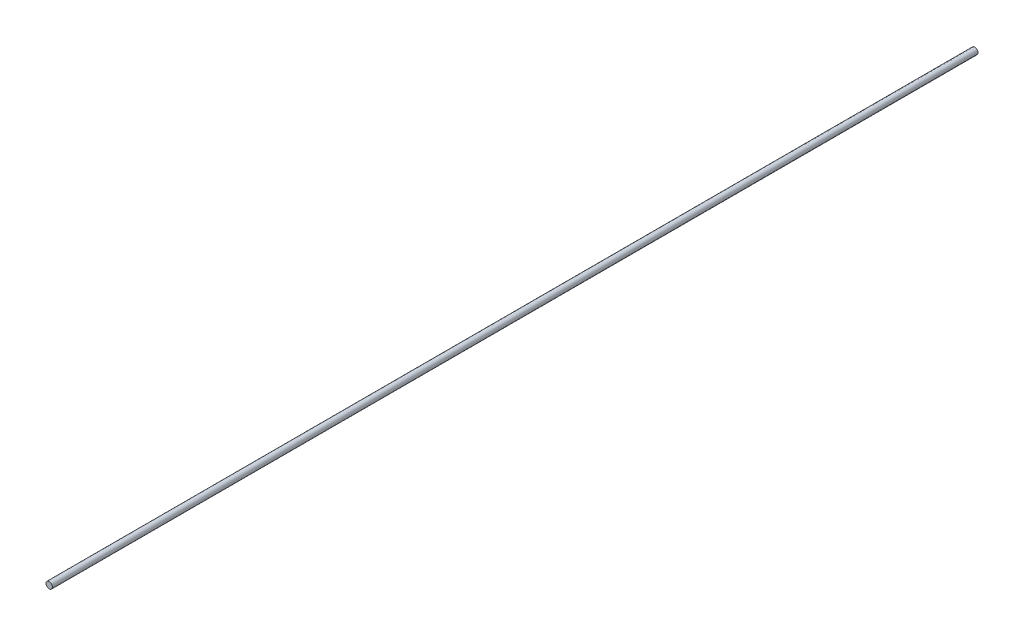
ISO-10303-21;
HEADER;
FILE_DESCRIPTION(('STEP AP214'),'2;1');
FILE_NAME('part.step','',(''),(''),'','','');
FILE_SCHEMA(('AUTOMOTIVE_DESIGN { 1 0 10303 214 1 1 1 1 }'));
ENDSEC;
DATA;
#1=APPLICATION_CONTEXT('core data for automotive mechanical design processes');
#2=APPLICATION_PROTOCOL_DEFINITION('international standard','automotive_design',2000,#1);
#3=PRODUCT_CONTEXT('',#1,'mechanical');
#4=PRODUCT('Part','Part','',(#3));
#5=PRODUCT_RELATED_PRODUCT_CATEGORY('part','',(#4));
#6=PRODUCT_DEFINITION_FORMATION('','',#4);
#7=PRODUCT_DEFINITION_CONTEXT('part definition',#1,'design');
#8=PRODUCT_DEFINITION('design','',#6,#7);
#9=PRODUCT_DEFINITION_SHAPE('','',#8);
#10=(LENGTH_UNIT() NAMED_UNIT(*) SI_UNIT(.MILLI.,.METRE.));
#11=(NAMED_UNIT(*) PLANE_ANGLE_UNIT() SI_UNIT($,.RADIAN.));
#12=(NAMED_UNIT(*) SI_UNIT($,.STERADIAN.) SOLID_ANGLE_UNIT());
#13=UNCERTAINTY_MEASURE_WITH_UNIT(LENGTH_MEASURE(1.E-05),#10,'distance_accuracy_value','');
#14=(GEOMETRIC_REPRESENTATION_CONTEXT(3) GLOBAL_UNCERTAINTY_ASSIGNED_CONTEXT((#13)) GLOBAL_UNIT_ASSIGNED_CONTEXT((#10,
#11,#12)) REPRESENTATION_CONTEXT('',''));
#15=CARTESIAN_POINT('',(0.,0.,0.));
#16=DIRECTION('',(0.,0.,1.));
#17=DIRECTION('',(1.,0.,0.));
#18=AXIS2_PLACEMENT_3D('',#15,#16,#17);
#19=CARTESIAN_POINT('',(0.,0.,2286.));
#20=DIRECTION('',(0.,0.,-1.));
#21=DIRECTION('',(-1.,0.,0.));
#22=AXIS2_PLACEMENT_3D('',#19,#20,#21);
#23=CYLINDRICAL_SURFACE('',#22,7.9375);
#24=CARTESIAN_POINT('',(0.,0.,2286.));
#25=DIRECTION('',(0.,0.,1.));
#26=DIRECTION('',(1.,0.,0.));
#27=AXIS2_PLACEMENT_3D('',#24,#25,#26);
#28=CIRCLE('',#27,7.9375);
#29=CARTESIAN_POINT('',(7.9375,0.,2286.));
#30=VERTEX_POINT('',#29);
#31=EDGE_CURVE('E10',#30,#30,#28,.T.);
#32=ORIENTED_EDGE('',*,*,#31,.F.);
#33=EDGE_LOOP('',(#32));
#34=FACE_BOUND('',#33,.T.);
#35=CARTESIAN_POINT('',(0.,0.,0.));
#36=DIRECTION('',(0.,0.,1.));
#37=DIRECTION('',(1.,0.,0.));
#38=AXIS2_PLACEMENT_3D('',#35,#36,#37);
#39=CIRCLE('',#38,7.9375);
#40=CARTESIAN_POINT('',(7.9375,0.,0.));
#41=VERTEX_POINT('',#40);
#42=EDGE_CURVE('E44',#41,#41,#39,.T.);
#43=ORIENTED_EDGE('',*,*,#42,.T.);
#44=EDGE_LOOP('',(#43));
#45=FACE_BOUND('',#44,.T.);
#46=ADVANCED_FACE('F41',(#34,#45),#23,.T.);
#47=CARTESIAN_POINT('',(0.,0.,2286.));
#48=DIRECTION('',(0.,0.,1.));
#49=DIRECTION('',(1.,0.,0.));
#50=AXIS2_PLACEMENT_3D('',#47,#48,#49);
#51=PLANE('',#50);
#52=ORIENTED_EDGE('',*,*,#31,.T.);
#53=EDGE_LOOP('',(#52));
#54=FACE_BOUND('',#53,.T.);
#55=ADVANCED_FACE('F58',(#54),#51,.T.);
#56=CARTESIAN_POINT('',(0.,0.,0.));
#57=DIRECTION('',(0.,0.,1.));
#58=DIRECTION('',(1.,0.,0.));
#59=AXIS2_PLACEMENT_3D('',#56,#57,#58);
#60=PLANE('',#59);
#61=ORIENTED_EDGE('',*,*,#42,.F.);
#62=EDGE_LOOP('',(#61));
#63=FACE_BOUND('',#62,.T.);
#64=ADVANCED_FACE('F56',(#63),#60,.F.);
#65=CLOSED_SHELL('',(#46,#55,#64));
#66=MANIFOLD_SOLID_BREP('B2',#65);
#67=ADVANCED_BREP_SHAPE_REPRESENTATION('',(#18,#66),#14);
#68=SHAPE_DEFINITION_REPRESENTATION(#9,#67);
ENDSEC;
END-ISO-10303-21;
